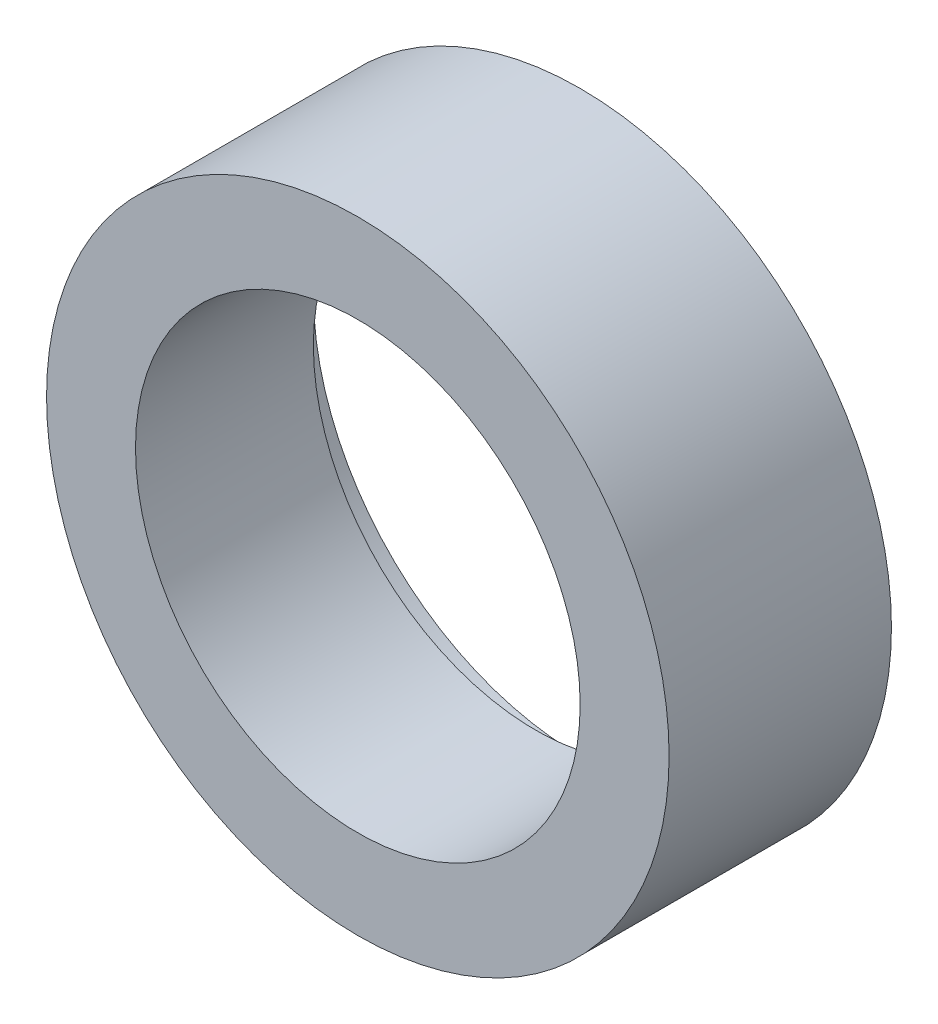
ISO-10303-21;
HEADER;
FILE_DESCRIPTION(('STEP AP214'),'2;1');
FILE_NAME('part.step','',(''),(''),'','','');
FILE_SCHEMA(('AUTOMOTIVE_DESIGN { 1 0 10303 214 1 1 1 1 }'));
ENDSEC;
DATA;
#1=APPLICATION_CONTEXT('core data for automotive mechanical design processes');
#2=APPLICATION_PROTOCOL_DEFINITION('international standard','automotive_design',2000,#1);
#3=PRODUCT_CONTEXT('',#1,'mechanical');
#4=PRODUCT('Part','Part','',(#3));
#5=PRODUCT_RELATED_PRODUCT_CATEGORY('part','',(#4));
#6=PRODUCT_DEFINITION_FORMATION('','',#4);
#7=PRODUCT_DEFINITION_CONTEXT('part definition',#1,'design');
#8=PRODUCT_DEFINITION('design','',#6,#7);
#9=PRODUCT_DEFINITION_SHAPE('','',#8);
#10=(LENGTH_UNIT() NAMED_UNIT(*) SI_UNIT(.MILLI.,.METRE.));
#11=(NAMED_UNIT(*) PLANE_ANGLE_UNIT() SI_UNIT($,.RADIAN.));
#12=(NAMED_UNIT(*) SI_UNIT($,.STERADIAN.) SOLID_ANGLE_UNIT());
#13=UNCERTAINTY_MEASURE_WITH_UNIT(LENGTH_MEASURE(1.E-05),#10,'distance_accuracy_value','');
#14=(GEOMETRIC_REPRESENTATION_CONTEXT(3) GLOBAL_UNCERTAINTY_ASSIGNED_CONTEXT((#13)) GLOBAL_UNIT_ASSIGNED_CONTEXT((#10,
#11,#12)) REPRESENTATION_CONTEXT('',''));
#15=CARTESIAN_POINT('',(0.,0.,0.));
#16=DIRECTION('',(0.,0.,1.));
#17=DIRECTION('',(1.,0.,0.));
#18=AXIS2_PLACEMENT_3D('',#15,#16,#17);
#19=CARTESIAN_POINT('',(0.,0.,7.9375));
#20=DIRECTION('',(0.,0.,1.));
#21=DIRECTION('',(1.,0.,0.));
#22=AXIS2_PLACEMENT_3D('',#19,#20,#21);
#23=PLANE('',#22);
#24=CARTESIAN_POINT('',(0.,0.,7.9375));
#25=DIRECTION('',(0.,0.,1.));
#26=DIRECTION('',(1.,0.,0.));
#27=AXIS2_PLACEMENT_3D('',#24,#25,#26);
#28=CIRCLE('',#27,22.225);
#29=CARTESIAN_POINT('',(22.225,0.,7.9375));
#30=VERTEX_POINT('',#29);
#31=EDGE_CURVE('E10',#30,#30,#28,.T.);
#32=ORIENTED_EDGE('',*,*,#31,.T.);
#33=EDGE_LOOP('',(#32));
#34=FACE_BOUND('',#33,.T.);
#35=CARTESIAN_POINT('',(0.,0.,7.9375));
#36=DIRECTION('',(0.,0.,1.));
#37=DIRECTION('',(1.,0.,0.));
#38=AXIS2_PLACEMENT_3D('',#35,#36,#37);
#39=CIRCLE('',#38,15.875);
#40=CARTESIAN_POINT('',(15.875,0.,7.9375));
#41=VERTEX_POINT('',#40);
#42=EDGE_CURVE('E57',#41,#41,#39,.T.);
#43=ORIENTED_EDGE('',*,*,#42,.F.);
#44=EDGE_LOOP('',(#43));
#45=FACE_BOUND('',#44,.T.);
#46=ADVANCED_FACE('F35',(#34,#45),#23,.T.);
#47=CARTESIAN_POINT('',(0.,0.,-0.348280892973182));
#48=DIRECTION('',(0.,0.,1.));
#49=DIRECTION('',(1.,0.,0.));
#50=AXIS2_PLACEMENT_3D('',#47,#48,#49);
#51=CYLINDRICAL_SURFACE('',#50,22.225);
#52=CARTESIAN_POINT('',(0.,0.,-7.9375));
#53=DIRECTION('',(0.,0.,1.));
#54=DIRECTION('',(1.,0.,0.));
#55=AXIS2_PLACEMENT_3D('',#52,#53,#54);
#56=CIRCLE('',#55,22.225);
#57=CARTESIAN_POINT('',(22.225,0.,-7.9375));
#58=VERTEX_POINT('',#57);
#59=EDGE_CURVE('E41',#58,#58,#56,.T.);
#60=ORIENTED_EDGE('',*,*,#59,.T.);
#61=EDGE_LOOP('',(#60));
#62=FACE_BOUND('',#61,.T.);
#63=ORIENTED_EDGE('',*,*,#31,.F.);
#64=EDGE_LOOP('',(#63));
#65=FACE_BOUND('',#64,.T.);
#66=ADVANCED_FACE('F64',(#62,#65),#51,.T.);
#67=CARTESIAN_POINT('',(0.,0.,-7.9375));
#68=DIRECTION('',(0.,0.,1.));
#69=DIRECTION('',(1.,0.,0.));
#70=AXIS2_PLACEMENT_3D('',#67,#68,#69);
#71=PLANE('',#70);
#72=ORIENTED_EDGE('',*,*,#59,.F.);
#73=EDGE_LOOP('',(#72));
#74=FACE_BOUND('',#73,.T.);
#75=CARTESIAN_POINT('',(0.,0.,-7.9375));
#76=DIRECTION('',(0.,0.,1.));
#77=DIRECTION('',(1.,0.,0.));
#78=AXIS2_PLACEMENT_3D('',#75,#76,#77);
#79=CIRCLE('',#78,19.05);
#80=CARTESIAN_POINT('',(19.05,0.,-7.9375));
#81=VERTEX_POINT('',#80);
#82=EDGE_CURVE('E45',#81,#81,#79,.T.);
#83=ORIENTED_EDGE('',*,*,#82,.T.);
#84=EDGE_LOOP('',(#83));
#85=FACE_BOUND('',#84,.T.);
#86=ADVANCED_FACE('F68',(#74,#85),#71,.F.);
#87=CARTESIAN_POINT('',(0.,0.,-0.348280892973182));
#88=DIRECTION('',(0.,0.,1.));
#89=DIRECTION('',(1.,0.,0.));
#90=AXIS2_PLACEMENT_3D('',#87,#88,#89);
#91=CYLINDRICAL_SURFACE('',#90,19.05);
#92=ORIENTED_EDGE('',*,*,#82,.F.);
#93=EDGE_LOOP('',(#92));
#94=FACE_BOUND('',#93,.T.);
#95=CARTESIAN_POINT('',(0.,0.,-4.7625));
#96=DIRECTION('',(0.,0.,1.));
#97=DIRECTION('',(1.,0.,0.));
#98=AXIS2_PLACEMENT_3D('',#95,#96,#97);
#99=CIRCLE('',#98,19.05);
#100=CARTESIAN_POINT('',(19.05,0.,-4.7625));
#101=VERTEX_POINT('',#100);
#102=EDGE_CURVE('E49',#101,#101,#99,.T.);
#103=ORIENTED_EDGE('',*,*,#102,.T.);
#104=EDGE_LOOP('',(#103));
#105=FACE_BOUND('',#104,.T.);
#106=ADVANCED_FACE('F72',(#94,#105),#91,.F.);
#107=CARTESIAN_POINT('',(0.,0.,-4.7625));
#108=DIRECTION('',(0.,0.,1.));
#109=DIRECTION('',(1.,0.,0.));
#110=AXIS2_PLACEMENT_3D('',#107,#108,#109);
#111=PLANE('',#110);
#112=ORIENTED_EDGE('',*,*,#102,.F.);
#113=EDGE_LOOP('',(#112));
#114=FACE_BOUND('',#113,.T.);
#115=CARTESIAN_POINT('',(0.,0.,-4.7625));
#116=DIRECTION('',(0.,0.,1.));
#117=DIRECTION('',(1.,0.,0.));
#118=AXIS2_PLACEMENT_3D('',#115,#116,#117);
#119=CIRCLE('',#118,15.875);
#120=CARTESIAN_POINT('',(15.875,0.,-4.7625));
#121=VERTEX_POINT('',#120);
#122=EDGE_CURVE('E54',#121,#121,#119,.T.);
#123=ORIENTED_EDGE('',*,*,#122,.T.);
#124=EDGE_LOOP('',(#123));
#125=FACE_BOUND('',#124,.T.);
#126=ADVANCED_FACE('F79',(#114,#125),#111,.F.);
#127=CARTESIAN_POINT('',(0.,0.,-0.348280892973182));
#128=DIRECTION('',(0.,0.,1.));
#129=DIRECTION('',(1.,0.,0.));
#130=AXIS2_PLACEMENT_3D('',#127,#128,#129);
#131=CYLINDRICAL_SURFACE('',#130,15.875);
#132=ORIENTED_EDGE('',*,*,#122,.F.);
#133=EDGE_LOOP('',(#132));
#134=FACE_BOUND('',#133,.T.);
#135=ORIENTED_EDGE('',*,*,#42,.T.);
#136=EDGE_LOOP('',(#135));
#137=FACE_BOUND('',#136,.T.);
#138=ADVANCED_FACE('F61',(#134,#137),#131,.F.);
#139=CLOSED_SHELL('',(#46,#66,#86,#106,#126,#138));
#140=MANIFOLD_SOLID_BREP('B2',#139);
#141=ADVANCED_BREP_SHAPE_REPRESENTATION('',(#18,#140),#14);
#142=SHAPE_DEFINITION_REPRESENTATION(#9,#141);
ENDSEC;
END-ISO-10303-21;
